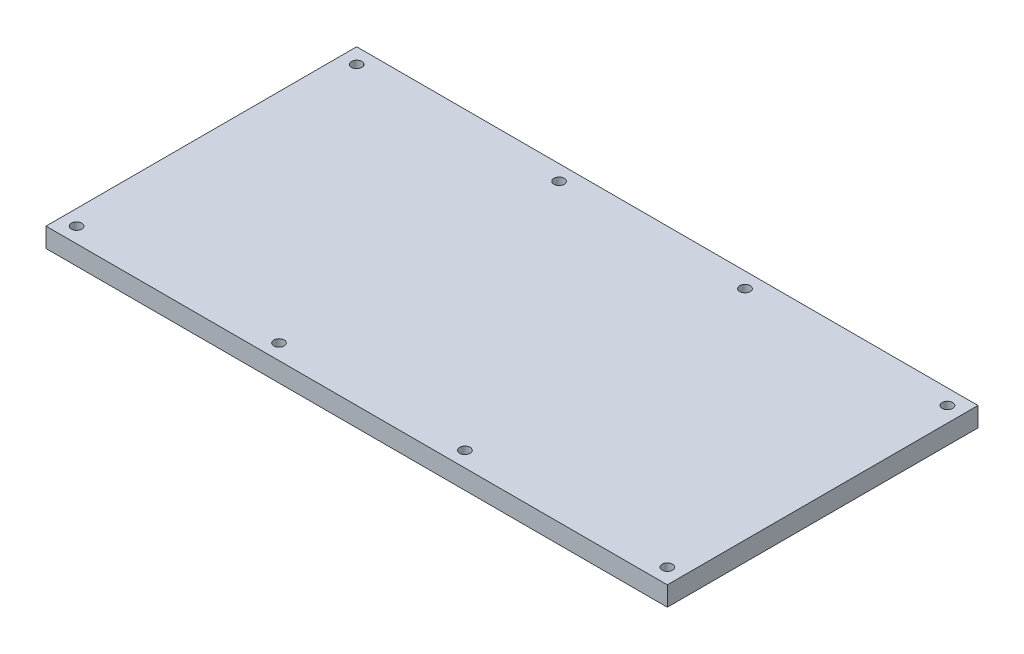
ISO-10303-21;
HEADER;
FILE_DESCRIPTION(('STEP AP214'),'2;1');
FILE_NAME('part.step','',(''),(''),'','','');
FILE_SCHEMA(('AUTOMOTIVE_DESIGN { 1 0 10303 214 1 1 1 1 }'));
ENDSEC;
DATA;
#1=APPLICATION_CONTEXT('core data for automotive mechanical design processes');
#2=APPLICATION_PROTOCOL_DEFINITION('international standard','automotive_design',2000,#1);
#3=PRODUCT_CONTEXT('',#1,'mechanical');
#4=PRODUCT('Part','Part','',(#3));
#5=PRODUCT_RELATED_PRODUCT_CATEGORY('part','',(#4));
#6=PRODUCT_DEFINITION_FORMATION('','',#4);
#7=PRODUCT_DEFINITION_CONTEXT('part definition',#1,'design');
#8=PRODUCT_DEFINITION('design','',#6,#7);
#9=PRODUCT_DEFINITION_SHAPE('','',#8);
#10=(LENGTH_UNIT() NAMED_UNIT(*) SI_UNIT(.MILLI.,.METRE.));
#11=(NAMED_UNIT(*) PLANE_ANGLE_UNIT() SI_UNIT($,.RADIAN.));
#12=(NAMED_UNIT(*) SI_UNIT($,.STERADIAN.) SOLID_ANGLE_UNIT());
#13=UNCERTAINTY_MEASURE_WITH_UNIT(LENGTH_MEASURE(1.E-05),#10,'distance_accuracy_value','');
#14=(GEOMETRIC_REPRESENTATION_CONTEXT(3) GLOBAL_UNCERTAINTY_ASSIGNED_CONTEXT((#13)) GLOBAL_UNIT_ASSIGNED_CONTEXT((#10,
#11,#12)) REPRESENTATION_CONTEXT('',''));
#15=CARTESIAN_POINT('',(0.,0.,0.));
#16=DIRECTION('',(0.,0.,1.));
#17=DIRECTION('',(1.,0.,0.));
#18=AXIS2_PLACEMENT_3D('',#15,#16,#17);
#19=CARTESIAN_POINT('',(0.,6.35,0.));
#20=DIRECTION('',(0.,0.,-1.));
#21=DIRECTION('',(-1.,0.,0.));
#22=AXIS2_PLACEMENT_3D('',#19,#20,#21);
#23=PLANE('',#22);
#24=DIRECTION('',(1.,0.,0.));
#25=VECTOR('',#24,1.);
#26=CARTESIAN_POINT('',(0.,0.,0.));
#27=LINE('',#26,#25);
#28=CARTESIAN_POINT('',(-127.,0.,0.));
#29=VERTEX_POINT('',#28);
#30=CARTESIAN_POINT('',(76.2,0.,0.));
#31=VERTEX_POINT('',#30);
#32=EDGE_CURVE('E68',#29,#31,#27,.T.);
#33=ORIENTED_EDGE('',*,*,#32,.T.);
#34=DIRECTION('',(0.,-1.,0.));
#35=VECTOR('',#34,1.);
#36=CARTESIAN_POINT('',(76.2,6.35,0.));
#37=LINE('',#36,#35);
#38=CARTESIAN_POINT('',(76.2,6.35,0.));
#39=VERTEX_POINT('',#38);
#40=EDGE_CURVE('E11',#39,#31,#37,.T.);
#41=ORIENTED_EDGE('',*,*,#40,.F.);
#42=DIRECTION('',(1.,0.,0.));
#43=VECTOR('',#42,1.);
#44=CARTESIAN_POINT('',(0.,6.35,0.));
#45=LINE('',#44,#43);
#46=CARTESIAN_POINT('',(-127.,6.35,0.));
#47=VERTEX_POINT('',#46);
#48=EDGE_CURVE('E93',#47,#39,#45,.T.);
#49=ORIENTED_EDGE('',*,*,#48,.F.);
#50=DIRECTION('',(0.,-1.,0.));
#51=VECTOR('',#50,1.);
#52=CARTESIAN_POINT('',(-127.,6.35,0.));
#53=LINE('',#52,#51);
#54=EDGE_CURVE('E102',#47,#29,#53,.T.);
#55=ORIENTED_EDGE('',*,*,#54,.T.);
#56=EDGE_LOOP('',(#33,#41,#49,#55));
#57=FACE_BOUND('',#56,.T.);
#58=ADVANCED_FACE('F41',(#57),#23,.F.);
#59=CARTESIAN_POINT('',(76.2,6.35,0.));
#60=DIRECTION('',(-1.,0.,0.));
#61=DIRECTION('',(0.,0.,1.));
#62=AXIS2_PLACEMENT_3D('',#59,#60,#61);
#63=PLANE('',#62);
#64=DIRECTION('',(0.,0.,-1.));
#65=VECTOR('',#64,1.);
#66=CARTESIAN_POINT('',(76.2,0.,0.));
#67=LINE('',#66,#65);
#68=CARTESIAN_POINT('',(76.2,0.,-101.6));
#69=VERTEX_POINT('',#68);
#70=EDGE_CURVE('E94',#31,#69,#67,.T.);
#71=ORIENTED_EDGE('',*,*,#70,.T.);
#72=DIRECTION('',(0.,-1.,0.));
#73=VECTOR('',#72,1.);
#74=CARTESIAN_POINT('',(76.2,6.35,-101.6));
#75=LINE('',#74,#73);
#76=CARTESIAN_POINT('',(76.2,6.35,-101.6));
#77=VERTEX_POINT('',#76);
#78=EDGE_CURVE('E49',#77,#69,#75,.T.);
#79=ORIENTED_EDGE('',*,*,#78,.F.);
#80=DIRECTION('',(0.,0.,-1.));
#81=VECTOR('',#80,1.);
#82=CARTESIAN_POINT('',(76.2,6.35,0.));
#83=LINE('',#82,#81);
#84=EDGE_CURVE('E57',#39,#77,#83,.T.);
#85=ORIENTED_EDGE('',*,*,#84,.F.);
#86=ORIENTED_EDGE('',*,*,#40,.T.);
#87=EDGE_LOOP('',(#71,#79,#85,#86));
#88=FACE_BOUND('',#87,.T.);
#89=ADVANCED_FACE('F144',(#88),#63,.F.);
#90=CARTESIAN_POINT('',(0.,6.35,-101.6));
#91=DIRECTION('',(0.,0.,1.));
#92=DIRECTION('',(1.,0.,0.));
#93=AXIS2_PLACEMENT_3D('',#90,#91,#92);
#94=PLANE('',#93);
#95=DIRECTION('',(-1.,0.,0.));
#96=VECTOR('',#95,1.);
#97=CARTESIAN_POINT('',(0.,0.,-101.6));
#98=LINE('',#97,#96);
#99=CARTESIAN_POINT('',(-127.,0.,-101.6));
#100=VERTEX_POINT('',#99);
#101=EDGE_CURVE('E85',#69,#100,#98,.T.);
#102=ORIENTED_EDGE('',*,*,#101,.T.);
#103=DIRECTION('',(0.,-1.,0.));
#104=VECTOR('',#103,1.);
#105=CARTESIAN_POINT('',(-127.,6.35,-101.6));
#106=LINE('',#105,#104);
#107=CARTESIAN_POINT('',(-127.,6.35,-101.6));
#108=VERTEX_POINT('',#107);
#109=EDGE_CURVE('E88',#108,#100,#106,.T.);
#110=ORIENTED_EDGE('',*,*,#109,.F.);
#111=DIRECTION('',(-1.,0.,0.));
#112=VECTOR('',#111,1.);
#113=CARTESIAN_POINT('',(0.,6.35,-101.6));
#114=LINE('',#113,#112);
#115=EDGE_CURVE('E74',#77,#108,#114,.T.);
#116=ORIENTED_EDGE('',*,*,#115,.F.);
#117=ORIENTED_EDGE('',*,*,#78,.T.);
#118=EDGE_LOOP('',(#102,#110,#116,#117));
#119=FACE_BOUND('',#118,.T.);
#120=ADVANCED_FACE('F87',(#119),#94,.F.);
#121=CARTESIAN_POINT('',(0.,6.35,0.));
#122=DIRECTION('',(0.,-1.,0.));
#123=DIRECTION('',(0.,0.,-1.));
#124=AXIS2_PLACEMENT_3D('',#121,#122,#123);
#125=PLANE('',#124);
#126=CARTESIAN_POINT('',(5.,6.35,-5.));
#127=DIRECTION('',(0.,1.,0.));
#128=DIRECTION('',(0.,0.,-1.));
#129=AXIS2_PLACEMENT_3D('',#126,#127,#128);
#130=CIRCLE('',#129,1.7);
#131=CARTESIAN_POINT('',(5.,6.35,-6.7));
#132=VERTEX_POINT('',#131);
#133=EDGE_CURVE('E129',#132,#132,#130,.T.);
#134=ORIENTED_EDGE('',*,*,#133,.F.);
#135=EDGE_LOOP('',(#134));
#136=FACE_BOUND('',#135,.T.);
#137=CARTESIAN_POINT('',(71.2,6.35,-5.));
#138=DIRECTION('',(0.,1.,0.));
#139=DIRECTION('',(0.,0.,1.));
#140=AXIS2_PLACEMENT_3D('',#137,#138,#139);
#141=CIRCLE('',#140,1.7);
#142=CARTESIAN_POINT('',(71.2,6.35,-3.30000000000001));
#143=VERTEX_POINT('',#142);
#144=EDGE_CURVE('E123',#143,#143,#141,.T.);
#145=ORIENTED_EDGE('',*,*,#144,.F.);
#146=EDGE_LOOP('',(#145));
#147=FACE_BOUND('',#146,.T.);
#148=CARTESIAN_POINT('',(71.2,6.35,-96.6));
#149=DIRECTION('',(0.,1.,0.));
#150=DIRECTION('',(0.,0.,-1.));
#151=AXIS2_PLACEMENT_3D('',#148,#149,#150);
#152=CIRCLE('',#151,1.7);
#153=CARTESIAN_POINT('',(71.2,6.35,-98.3));
#154=VERTEX_POINT('',#153);
#155=EDGE_CURVE('E116',#154,#154,#152,.T.);
#156=ORIENTED_EDGE('',*,*,#155,.F.);
#157=EDGE_LOOP('',(#156));
#158=FACE_BOUND('',#157,.T.);
#159=CARTESIAN_POINT('',(5.,6.35,-96.6));
#160=DIRECTION('',(0.,1.,0.));
#161=DIRECTION('',(0.,0.,1.));
#162=AXIS2_PLACEMENT_3D('',#159,#160,#161);
#163=CIRCLE('',#162,1.70000000000001);
#164=CARTESIAN_POINT('',(5.,6.35,-94.9));
#165=VERTEX_POINT('',#164);
#166=EDGE_CURVE('E119',#165,#165,#163,.T.);
#167=ORIENTED_EDGE('',*,*,#166,.F.);
#168=EDGE_LOOP('',(#167));
#169=FACE_BOUND('',#168,.T.);
#170=ORIENTED_EDGE('',*,*,#115,.T.);
#171=DIRECTION('',(0.,0.,-1.));
#172=VECTOR('',#171,1.);
#173=CARTESIAN_POINT('',(-127.,6.35,0.));
#174=LINE('',#173,#172);
#175=EDGE_CURVE('E101',#47,#108,#174,.T.);
#176=ORIENTED_EDGE('',*,*,#175,.F.);
#177=ORIENTED_EDGE('',*,*,#48,.T.);
#178=ORIENTED_EDGE('',*,*,#84,.T.);
#179=EDGE_LOOP('',(#170,#176,#177,#178));
#180=FACE_BOUND('',#179,.T.);
#181=CARTESIAN_POINT('',(-55.8,6.35,-5.));
#182=DIRECTION('',(0.,-1.,0.));
#183=DIRECTION('',(0.,0.,-1.));
#184=AXIS2_PLACEMENT_3D('',#181,#182,#183);
#185=CIRCLE('',#184,1.7);
#186=CARTESIAN_POINT('',(-55.8,6.35,-6.7));
#187=VERTEX_POINT('',#186);
#188=EDGE_CURVE('E153',#187,#187,#185,.T.);
#189=ORIENTED_EDGE('',*,*,#188,.T.);
#190=EDGE_LOOP('',(#189));
#191=FACE_BOUND('',#190,.T.);
#192=CARTESIAN_POINT('',(-122.,6.35,-5.));
#193=DIRECTION('',(0.,-1.,0.));
#194=DIRECTION('',(0.,0.,1.));
#195=AXIS2_PLACEMENT_3D('',#192,#193,#194);
#196=CIRCLE('',#195,1.7);
#197=CARTESIAN_POINT('',(-122.,6.35,-3.30000000000001));
#198=VERTEX_POINT('',#197);
#199=EDGE_CURVE('E157',#198,#198,#196,.T.);
#200=ORIENTED_EDGE('',*,*,#199,.T.);
#201=EDGE_LOOP('',(#200));
#202=FACE_BOUND('',#201,.T.);
#203=CARTESIAN_POINT('',(-122.,6.35,-96.6));
#204=DIRECTION('',(0.,-1.,0.));
#205=DIRECTION('',(0.,0.,-1.));
#206=AXIS2_PLACEMENT_3D('',#203,#204,#205);
#207=CIRCLE('',#206,1.7);
#208=CARTESIAN_POINT('',(-122.,6.35,-98.3));
#209=VERTEX_POINT('',#208);
#210=EDGE_CURVE('E161',#209,#209,#207,.T.);
#211=ORIENTED_EDGE('',*,*,#210,.T.);
#212=EDGE_LOOP('',(#211));
#213=FACE_BOUND('',#212,.T.);
#214=CARTESIAN_POINT('',(-55.8,6.35,-96.6));
#215=DIRECTION('',(0.,-1.,0.));
#216=DIRECTION('',(0.,0.,1.));
#217=AXIS2_PLACEMENT_3D('',#214,#215,#216);
#218=CIRCLE('',#217,1.70000000000001);
#219=CARTESIAN_POINT('',(-55.8,6.35,-94.9));
#220=VERTEX_POINT('',#219);
#221=EDGE_CURVE('E110',#220,#220,#218,.T.);
#222=ORIENTED_EDGE('',*,*,#221,.T.);
#223=EDGE_LOOP('',(#222));
#224=FACE_BOUND('',#223,.T.);
#225=ADVANCED_FACE('F145',(#136,#147,#158,#169,#180,#191,#202,#213,#224),#125,.F.);
#226=CARTESIAN_POINT('',(0.,0.,0.));
#227=DIRECTION('',(0.,-1.,0.));
#228=DIRECTION('',(0.,0.,-1.));
#229=AXIS2_PLACEMENT_3D('',#226,#227,#228);
#230=PLANE('',#229);
#231=CARTESIAN_POINT('',(5.,0.,-5.));
#232=DIRECTION('',(0.,1.,0.));
#233=DIRECTION('',(0.,0.,-1.));
#234=AXIS2_PLACEMENT_3D('',#231,#232,#233);
#235=CIRCLE('',#234,1.7);
#236=CARTESIAN_POINT('',(5.,0.,-6.7));
#237=VERTEX_POINT('',#236);
#238=EDGE_CURVE('E115',#237,#237,#235,.T.);
#239=ORIENTED_EDGE('',*,*,#238,.T.);
#240=EDGE_LOOP('',(#239));
#241=FACE_BOUND('',#240,.T.);
#242=CARTESIAN_POINT('',(71.2,0.,-5.));
#243=DIRECTION('',(0.,1.,0.));
#244=DIRECTION('',(0.,0.,1.));
#245=AXIS2_PLACEMENT_3D('',#242,#243,#244);
#246=CIRCLE('',#245,1.7);
#247=CARTESIAN_POINT('',(71.2,0.,-3.30000000000001));
#248=VERTEX_POINT('',#247);
#249=EDGE_CURVE('E126',#248,#248,#246,.T.);
#250=ORIENTED_EDGE('',*,*,#249,.T.);
#251=EDGE_LOOP('',(#250));
#252=FACE_BOUND('',#251,.T.);
#253=CARTESIAN_POINT('',(71.2,0.,-96.6));
#254=DIRECTION('',(0.,1.,0.));
#255=DIRECTION('',(0.,0.,-1.));
#256=AXIS2_PLACEMENT_3D('',#253,#254,#255);
#257=CIRCLE('',#256,1.7);
#258=CARTESIAN_POINT('',(71.2,0.,-98.3));
#259=VERTEX_POINT('',#258);
#260=EDGE_CURVE('E120',#259,#259,#257,.T.);
#261=ORIENTED_EDGE('',*,*,#260,.T.);
#262=EDGE_LOOP('',(#261));
#263=FACE_BOUND('',#262,.T.);
#264=CARTESIAN_POINT('',(5.,0.,-96.6));
#265=DIRECTION('',(0.,1.,0.));
#266=DIRECTION('',(0.,0.,1.));
#267=AXIS2_PLACEMENT_3D('',#264,#265,#266);
#268=CIRCLE('',#267,1.70000000000001);
#269=CARTESIAN_POINT('',(5.,0.,-94.9));
#270=VERTEX_POINT('',#269);
#271=EDGE_CURVE('E134',#270,#270,#268,.T.);
#272=ORIENTED_EDGE('',*,*,#271,.T.);
#273=EDGE_LOOP('',(#272));
#274=FACE_BOUND('',#273,.T.);
#275=ORIENTED_EDGE('',*,*,#32,.F.);
#276=DIRECTION('',(0.,0.,-1.));
#277=VECTOR('',#276,1.);
#278=CARTESIAN_POINT('',(-127.,0.,0.));
#279=LINE('',#278,#277);
#280=EDGE_CURVE('E100',#29,#100,#279,.T.);
#281=ORIENTED_EDGE('',*,*,#280,.T.);
#282=ORIENTED_EDGE('',*,*,#101,.F.);
#283=ORIENTED_EDGE('',*,*,#70,.F.);
#284=EDGE_LOOP('',(#275,#281,#282,#283));
#285=FACE_BOUND('',#284,.T.);
#286=CARTESIAN_POINT('',(-55.8,0.,-5.));
#287=DIRECTION('',(0.,-1.,0.));
#288=DIRECTION('',(0.,0.,-1.));
#289=AXIS2_PLACEMENT_3D('',#286,#287,#288);
#290=CIRCLE('',#289,1.7);
#291=CARTESIAN_POINT('',(-55.8,0.,-6.7));
#292=VERTEX_POINT('',#291);
#293=EDGE_CURVE('E168',#292,#292,#290,.T.);
#294=ORIENTED_EDGE('',*,*,#293,.F.);
#295=EDGE_LOOP('',(#294));
#296=FACE_BOUND('',#295,.T.);
#297=CARTESIAN_POINT('',(-122.,0.,-5.));
#298=DIRECTION('',(0.,-1.,0.));
#299=DIRECTION('',(0.,0.,1.));
#300=AXIS2_PLACEMENT_3D('',#297,#298,#299);
#301=CIRCLE('',#300,1.7);
#302=CARTESIAN_POINT('',(-122.,0.,-3.30000000000001));
#303=VERTEX_POINT('',#302);
#304=EDGE_CURVE('E172',#303,#303,#301,.T.);
#305=ORIENTED_EDGE('',*,*,#304,.F.);
#306=EDGE_LOOP('',(#305));
#307=FACE_BOUND('',#306,.T.);
#308=CARTESIAN_POINT('',(-122.,0.,-96.6));
#309=DIRECTION('',(0.,-1.,0.));
#310=DIRECTION('',(0.,0.,-1.));
#311=AXIS2_PLACEMENT_3D('',#308,#309,#310);
#312=CIRCLE('',#311,1.7);
#313=CARTESIAN_POINT('',(-122.,0.,-98.3));
#314=VERTEX_POINT('',#313);
#315=EDGE_CURVE('E165',#314,#314,#312,.T.);
#316=ORIENTED_EDGE('',*,*,#315,.F.);
#317=EDGE_LOOP('',(#316));
#318=FACE_BOUND('',#317,.T.);
#319=CARTESIAN_POINT('',(-55.8,0.,-96.6));
#320=DIRECTION('',(0.,-1.,0.));
#321=DIRECTION('',(0.,0.,1.));
#322=AXIS2_PLACEMENT_3D('',#319,#320,#321);
#323=CIRCLE('',#322,1.70000000000001);
#324=CARTESIAN_POINT('',(-55.8,0.,-94.9));
#325=VERTEX_POINT('',#324);
#326=EDGE_CURVE('E106',#325,#325,#323,.T.);
#327=ORIENTED_EDGE('',*,*,#326,.F.);
#328=EDGE_LOOP('',(#327));
#329=FACE_BOUND('',#328,.T.);
#330=ADVANCED_FACE('F104',(#241,#252,#263,#274,#285,#296,#307,#318,#329),#230,.T.);
#331=CARTESIAN_POINT('',(5.,0.,-96.6));
#332=DIRECTION('',(0.,1.,0.));
#333=DIRECTION('',(0.,0.,1.));
#334=AXIS2_PLACEMENT_3D('',#331,#332,#333);
#335=CYLINDRICAL_SURFACE('',#334,1.70000000000001);
#336=ORIENTED_EDGE('',*,*,#271,.F.);
#337=EDGE_LOOP('',(#336));
#338=FACE_BOUND('',#337,.T.);
#339=ORIENTED_EDGE('',*,*,#166,.T.);
#340=EDGE_LOOP('',(#339));
#341=FACE_BOUND('',#340,.T.);
#342=ADVANCED_FACE('F184',(#338,#341),#335,.F.);
#343=CARTESIAN_POINT('',(71.2,0.,-96.6));
#344=DIRECTION('',(0.,1.,0.));
#345=DIRECTION('',(0.,0.,1.));
#346=AXIS2_PLACEMENT_3D('',#343,#344,#345);
#347=CYLINDRICAL_SURFACE('',#346,1.7);
#348=ORIENTED_EDGE('',*,*,#260,.F.);
#349=EDGE_LOOP('',(#348));
#350=FACE_BOUND('',#349,.T.);
#351=ORIENTED_EDGE('',*,*,#155,.T.);
#352=EDGE_LOOP('',(#351));
#353=FACE_BOUND('',#352,.T.);
#354=ADVANCED_FACE('F213',(#350,#353),#347,.F.);
#355=CARTESIAN_POINT('',(71.2,0.,-5.));
#356=DIRECTION('',(0.,1.,0.));
#357=DIRECTION('',(0.,0.,1.));
#358=AXIS2_PLACEMENT_3D('',#355,#356,#357);
#359=CYLINDRICAL_SURFACE('',#358,1.7);
#360=ORIENTED_EDGE('',*,*,#249,.F.);
#361=EDGE_LOOP('',(#360));
#362=FACE_BOUND('',#361,.T.);
#363=ORIENTED_EDGE('',*,*,#144,.T.);
#364=EDGE_LOOP('',(#363));
#365=FACE_BOUND('',#364,.T.);
#366=ADVANCED_FACE('F216',(#362,#365),#359,.F.);
#367=CARTESIAN_POINT('',(5.,0.,-5.));
#368=DIRECTION('',(0.,1.,0.));
#369=DIRECTION('',(0.,0.,1.));
#370=AXIS2_PLACEMENT_3D('',#367,#368,#369);
#371=CYLINDRICAL_SURFACE('',#370,1.7);
#372=ORIENTED_EDGE('',*,*,#238,.F.);
#373=EDGE_LOOP('',(#372));
#374=FACE_BOUND('',#373,.T.);
#375=ORIENTED_EDGE('',*,*,#133,.T.);
#376=EDGE_LOOP('',(#375));
#377=FACE_BOUND('',#376,.T.);
#378=ADVANCED_FACE('F198',(#374,#377),#371,.F.);
#379=CARTESIAN_POINT('',(-127.,6.35,0.));
#380=DIRECTION('',(1.,0.,0.));
#381=DIRECTION('',(0.,0.,1.));
#382=AXIS2_PLACEMENT_3D('',#379,#380,#381);
#383=PLANE('',#382);
#384=ORIENTED_EDGE('',*,*,#280,.F.);
#385=ORIENTED_EDGE('',*,*,#54,.F.);
#386=ORIENTED_EDGE('',*,*,#175,.T.);
#387=ORIENTED_EDGE('',*,*,#109,.T.);
#388=EDGE_LOOP('',(#384,#385,#386,#387));
#389=FACE_BOUND('',#388,.T.);
#390=ADVANCED_FACE('F98',(#389),#383,.F.);
#391=CARTESIAN_POINT('',(-55.8,0.,-96.6));
#392=DIRECTION('',(0.,1.,0.));
#393=DIRECTION('',(0.,0.,1.));
#394=AXIS2_PLACEMENT_3D('',#391,#392,#393);
#395=CYLINDRICAL_SURFACE('',#394,1.70000000000001);
#396=ORIENTED_EDGE('',*,*,#326,.T.);
#397=EDGE_LOOP('',(#396));
#398=FACE_BOUND('',#397,.T.);
#399=ORIENTED_EDGE('',*,*,#221,.F.);
#400=EDGE_LOOP('',(#399));
#401=FACE_BOUND('',#400,.T.);
#402=ADVANCED_FACE('F189',(#398,#401),#395,.F.);
#403=CARTESIAN_POINT('',(-122.,0.,-96.6));
#404=DIRECTION('',(0.,1.,0.));
#405=DIRECTION('',(0.,0.,1.));
#406=AXIS2_PLACEMENT_3D('',#403,#404,#405);
#407=CYLINDRICAL_SURFACE('',#406,1.7);
#408=ORIENTED_EDGE('',*,*,#315,.T.);
#409=EDGE_LOOP('',(#408));
#410=FACE_BOUND('',#409,.T.);
#411=ORIENTED_EDGE('',*,*,#210,.F.);
#412=EDGE_LOOP('',(#411));
#413=FACE_BOUND('',#412,.T.);
#414=ADVANCED_FACE('F179',(#410,#413),#407,.F.);
#415=CARTESIAN_POINT('',(-122.,0.,-5.));
#416=DIRECTION('',(0.,1.,0.));
#417=DIRECTION('',(0.,0.,1.));
#418=AXIS2_PLACEMENT_3D('',#415,#416,#417);
#419=CYLINDRICAL_SURFACE('',#418,1.7);
#420=ORIENTED_EDGE('',*,*,#304,.T.);
#421=EDGE_LOOP('',(#420));
#422=FACE_BOUND('',#421,.T.);
#423=ORIENTED_EDGE('',*,*,#199,.F.);
#424=EDGE_LOOP('',(#423));
#425=FACE_BOUND('',#424,.T.);
#426=ADVANCED_FACE('F196',(#422,#425),#419,.F.);
#427=CARTESIAN_POINT('',(-55.8,0.,-5.));
#428=DIRECTION('',(0.,1.,0.));
#429=DIRECTION('',(0.,0.,1.));
#430=AXIS2_PLACEMENT_3D('',#427,#428,#429);
#431=CYLINDRICAL_SURFACE('',#430,1.7);
#432=ORIENTED_EDGE('',*,*,#293,.T.);
#433=EDGE_LOOP('',(#432));
#434=FACE_BOUND('',#433,.T.);
#435=ORIENTED_EDGE('',*,*,#188,.F.);
#436=EDGE_LOOP('',(#435));
#437=FACE_BOUND('',#436,.T.);
#438=ADVANCED_FACE('F271',(#434,#437),#431,.F.);
#439=CLOSED_SHELL('',(#58,#89,#120,#225,#330,#342,#354,#366,#378,#390,#402,#414,#426,#438));
#440=MANIFOLD_SOLID_BREP('B2',#439);
#441=ADVANCED_BREP_SHAPE_REPRESENTATION('',(#18,#440),#14);
#442=SHAPE_DEFINITION_REPRESENTATION(#9,#441);
ENDSEC;
END-ISO-10303-21;
